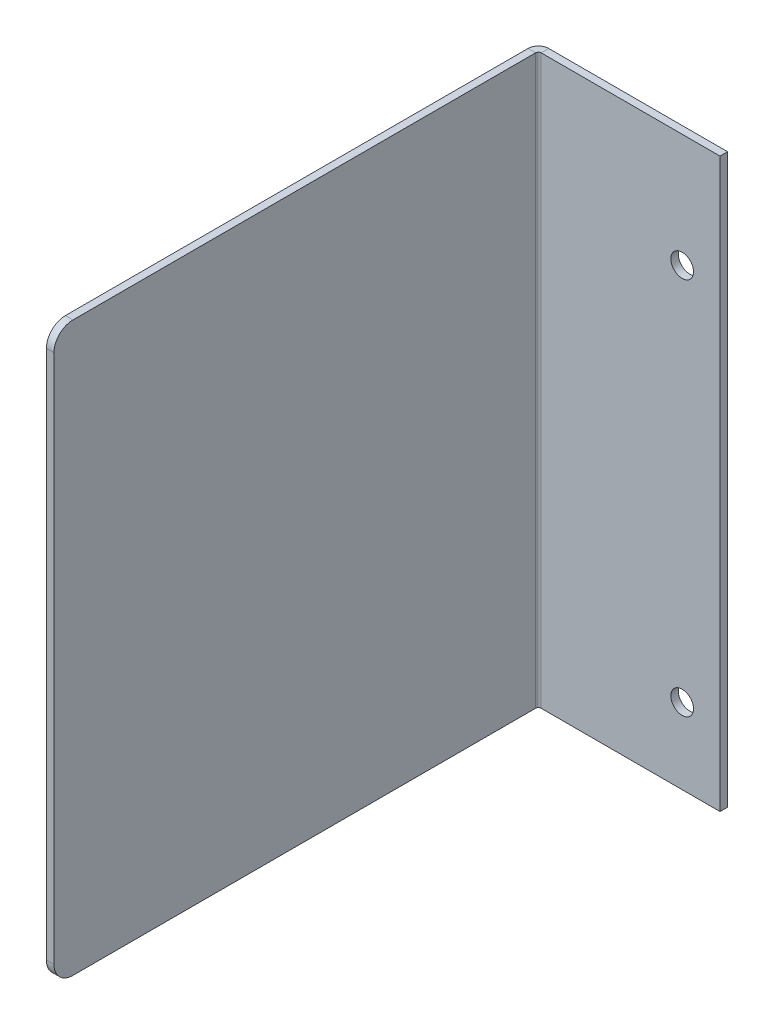
ISO-10303-21;
HEADER;
FILE_DESCRIPTION(('STEP AP214'),'2;1');
FILE_NAME('part.step','',(''),(''),'','','');
FILE_SCHEMA(('AUTOMOTIVE_DESIGN { 1 0 10303 214 1 1 1 1 }'));
ENDSEC;
DATA;
#1=APPLICATION_CONTEXT('core data for automotive mechanical design processes');
#2=APPLICATION_PROTOCOL_DEFINITION('international standard','automotive_design',2000,#1);
#3=PRODUCT_CONTEXT('',#1,'mechanical');
#4=PRODUCT('Part','Part','',(#3));
#5=PRODUCT_RELATED_PRODUCT_CATEGORY('part','',(#4));
#6=PRODUCT_DEFINITION_FORMATION('','',#4);
#7=PRODUCT_DEFINITION_CONTEXT('part definition',#1,'design');
#8=PRODUCT_DEFINITION('design','',#6,#7);
#9=PRODUCT_DEFINITION_SHAPE('','',#8);
#10=(LENGTH_UNIT() NAMED_UNIT(*) SI_UNIT(.MILLI.,.METRE.));
#11=(NAMED_UNIT(*) PLANE_ANGLE_UNIT() SI_UNIT($,.RADIAN.));
#12=(NAMED_UNIT(*) SI_UNIT($,.STERADIAN.) SOLID_ANGLE_UNIT());
#13=UNCERTAINTY_MEASURE_WITH_UNIT(LENGTH_MEASURE(1.E-05),#10,'distance_accuracy_value','');
#14=(GEOMETRIC_REPRESENTATION_CONTEXT(3) GLOBAL_UNCERTAINTY_ASSIGNED_CONTEXT((#13)) GLOBAL_UNIT_ASSIGNED_CONTEXT((#10,
#11,#12)) REPRESENTATION_CONTEXT('',''));
#15=CARTESIAN_POINT('',(0.,0.,0.));
#16=DIRECTION('',(0.,0.,1.));
#17=DIRECTION('',(1.,0.,0.));
#18=AXIS2_PLACEMENT_3D('',#15,#16,#17);
#19=CARTESIAN_POINT('',(-8.33759590792837,-142.250639386189,-2.));
#20=DIRECTION('',(0.,-1.,0.));
#21=DIRECTION('',(0.,0.,-1.));
#22=AXIS2_PLACEMENT_3D('',#19,#20,#21);
#23=PLANE('',#22);
#24=DIRECTION('',(1.,0.,0.));
#25=VECTOR('',#24,1.);
#26=CARTESIAN_POINT('',(-8.33759590792837,-142.250639386189,0.));
#27=LINE('',#26,#25);
#28=CARTESIAN_POINT('',(-5.60099590792838,-142.250639386189,0.));
#29=VERTEX_POINT('',#28);
#30=CARTESIAN_POINT('',(41.6624040920716,-142.250639386189,0.));
#31=VERTEX_POINT('',#30);
#32=EDGE_CURVE('E194',#29,#31,#27,.T.);
#33=ORIENTED_EDGE('',*,*,#32,.F.);
#34=DIRECTION('',(0.,0.,-1.));
#35=VECTOR('',#34,1.);
#36=CARTESIAN_POINT('',(-5.60099590792838,-142.250639386189,0.));
#37=LINE('',#36,#35);
#38=CARTESIAN_POINT('',(-5.60099590792835,-142.250639386189,-2.));
#39=VERTEX_POINT('',#38);
#40=EDGE_CURVE('E183',#29,#39,#37,.T.);
#41=ORIENTED_EDGE('',*,*,#40,.T.);
#42=DIRECTION('',(1.,0.,0.));
#43=VECTOR('',#42,1.);
#44=CARTESIAN_POINT('',(-8.33759590792837,-142.250639386189,-2.));
#45=LINE('',#44,#43);
#46=CARTESIAN_POINT('',(41.6624040920716,-142.250639386189,-2.));
#47=VERTEX_POINT('',#46);
#48=EDGE_CURVE('E197',#39,#47,#45,.T.);
#49=ORIENTED_EDGE('',*,*,#48,.T.);
#50=DIRECTION('',(0.,0.,1.));
#51=VECTOR('',#50,1.);
#52=CARTESIAN_POINT('',(41.6624040920716,-142.250639386189,-2.));
#53=LINE('',#52,#51);
#54=EDGE_CURVE('E206',#47,#31,#53,.T.);
#55=ORIENTED_EDGE('',*,*,#54,.T.);
#56=EDGE_LOOP('',(#33,#41,#49,#55));
#57=FACE_BOUND('',#56,.T.);
#58=ADVANCED_FACE('F59',(#57),#23,.T.);
#59=CARTESIAN_POINT('',(0.,0.,-2.));
#60=DIRECTION('',(0.,0.,1.));
#61=DIRECTION('',(1.,0.,0.));
#62=AXIS2_PLACEMENT_3D('',#59,#60,#61);
#63=PLANE('',#62);
#64=CARTESIAN_POINT('',(31.6624040920716,-122.250639386189,-2.));
#65=DIRECTION('',(0.,0.,1.));
#66=DIRECTION('',(1.,0.,0.));
#67=AXIS2_PLACEMENT_3D('',#64,#65,#66);
#68=CIRCLE('',#67,3.);
#69=CARTESIAN_POINT('',(34.6624040920716,-122.250639386189,-2.));
#70=VERTEX_POINT('',#69);
#71=EDGE_CURVE('E253',#70,#70,#68,.T.);
#72=ORIENTED_EDGE('',*,*,#71,.T.);
#73=EDGE_LOOP('',(#72));
#74=FACE_BOUND('',#73,.T.);
#75=CARTESIAN_POINT('',(31.6624040920716,-22.2506393861893,-2.));
#76=DIRECTION('',(0.,0.,1.));
#77=DIRECTION('',(1.,0.,0.));
#78=AXIS2_PLACEMENT_3D('',#75,#76,#77);
#79=CIRCLE('',#78,3.);
#80=CARTESIAN_POINT('',(34.6624040920716,-22.2506393861893,-2.));
#81=VERTEX_POINT('',#80);
#82=EDGE_CURVE('E180',#81,#81,#79,.T.);
#83=ORIENTED_EDGE('',*,*,#82,.T.);
#84=EDGE_LOOP('',(#83));
#85=FACE_BOUND('',#84,.T.);
#86=DIRECTION('',(0.,-1.,0.));
#87=VECTOR('',#86,1.);
#88=CARTESIAN_POINT('',(-5.60099590792835,-142.250639386189,-2.));
#89=LINE('',#88,#87);
#90=CARTESIAN_POINT('',(-5.60099590792838,7.74936061381078,-2.));
#91=VERTEX_POINT('',#90);
#92=EDGE_CURVE('E144',#39,#91,#89,.F.);
#93=ORIENTED_EDGE('',*,*,#92,.T.);
#94=DIRECTION('',(-1.,0.,0.));
#95=VECTOR('',#94,1.);
#96=CARTESIAN_POINT('',(-8.33759590792839,7.74936061381074,-2.));
#97=LINE('',#96,#95);
#98=CARTESIAN_POINT('',(41.6624040920716,7.74936061381074,-2.));
#99=VERTEX_POINT('',#98);
#100=EDGE_CURVE('E203',#99,#91,#97,.T.);
#101=ORIENTED_EDGE('',*,*,#100,.F.);
#102=DIRECTION('',(0.,1.,0.));
#103=VECTOR('',#102,1.);
#104=CARTESIAN_POINT('',(41.6624040920716,7.74936061381074,-2.));
#105=LINE('',#104,#103);
#106=EDGE_CURVE('E199',#47,#99,#105,.T.);
#107=ORIENTED_EDGE('',*,*,#106,.F.);
#108=ORIENTED_EDGE('',*,*,#48,.F.);
#109=EDGE_LOOP('',(#93,#101,#107,#108));
#110=FACE_BOUND('',#109,.T.);
#111=ADVANCED_FACE('F267',(#74,#85,#110),#63,.F.);
#112=CARTESIAN_POINT('',(0.,0.,0.));
#113=DIRECTION('',(0.,0.,1.));
#114=DIRECTION('',(1.,0.,0.));
#115=AXIS2_PLACEMENT_3D('',#112,#113,#114);
#116=PLANE('',#115);
#117=CARTESIAN_POINT('',(31.6624040920716,-122.250639386189,0.));
#118=DIRECTION('',(0.,0.,1.));
#119=DIRECTION('',(1.,0.,0.));
#120=AXIS2_PLACEMENT_3D('',#117,#118,#119);
#121=CIRCLE('',#120,3.);
#122=CARTESIAN_POINT('',(34.6624040920716,-122.250639386189,0.));
#123=VERTEX_POINT('',#122);
#124=EDGE_CURVE('E256',#123,#123,#121,.T.);
#125=ORIENTED_EDGE('',*,*,#124,.F.);
#126=EDGE_LOOP('',(#125));
#127=FACE_BOUND('',#126,.T.);
#128=CARTESIAN_POINT('',(31.6624040920716,-22.2506393861893,0.));
#129=DIRECTION('',(0.,0.,1.));
#130=DIRECTION('',(1.,0.,0.));
#131=AXIS2_PLACEMENT_3D('',#128,#129,#130);
#132=CIRCLE('',#131,3.);
#133=CARTESIAN_POINT('',(34.6624040920716,-22.2506393861893,0.));
#134=VERTEX_POINT('',#133);
#135=EDGE_CURVE('E250',#134,#134,#132,.T.);
#136=ORIENTED_EDGE('',*,*,#135,.F.);
#137=EDGE_LOOP('',(#136));
#138=FACE_BOUND('',#137,.T.);
#139=DIRECTION('',(-1.,0.,0.));
#140=VECTOR('',#139,1.);
#141=CARTESIAN_POINT('',(-8.33759590792839,7.74936061381074,0.));
#142=LINE('',#141,#140);
#143=CARTESIAN_POINT('',(41.6624040920716,7.74936061381074,0.));
#144=VERTEX_POINT('',#143);
#145=CARTESIAN_POINT('',(-5.60099590792838,7.74936061381076,0.));
#146=VERTEX_POINT('',#145);
#147=EDGE_CURVE('E200',#144,#146,#142,.T.);
#148=ORIENTED_EDGE('',*,*,#147,.T.);
#149=DIRECTION('',(0.,-1.,0.));
#150=VECTOR('',#149,1.);
#151=CARTESIAN_POINT('',(-5.60099590792838,-142.250639386189,0.));
#152=LINE('',#151,#150);
#153=EDGE_CURVE('E187',#29,#146,#152,.F.);
#154=ORIENTED_EDGE('',*,*,#153,.F.);
#155=ORIENTED_EDGE('',*,*,#32,.T.);
#156=DIRECTION('',(0.,1.,0.));
#157=VECTOR('',#156,1.);
#158=CARTESIAN_POINT('',(41.6624040920716,7.74936061381074,0.));
#159=LINE('',#158,#157);
#160=EDGE_CURVE('E208',#31,#144,#159,.T.);
#161=ORIENTED_EDGE('',*,*,#160,.T.);
#162=EDGE_LOOP('',(#148,#154,#155,#161));
#163=FACE_BOUND('',#162,.T.);
#164=ADVANCED_FACE('F263',(#127,#138,#163),#116,.T.);
#165=CARTESIAN_POINT('',(-8.33759590792839,7.74936061381074,-2.));
#166=DIRECTION('',(0.,1.,0.));
#167=DIRECTION('',(0.,0.,1.));
#168=AXIS2_PLACEMENT_3D('',#165,#166,#167);
#169=PLANE('',#168);
#170=DIRECTION('',(0.,0.,-1.));
#171=VECTOR('',#170,1.);
#172=CARTESIAN_POINT('',(-5.60099590792838,7.74936061381076,0.));
#173=LINE('',#172,#171);
#174=EDGE_CURVE('E191',#146,#91,#173,.T.);
#175=ORIENTED_EDGE('',*,*,#174,.F.);
#176=ORIENTED_EDGE('',*,*,#147,.F.);
#177=DIRECTION('',(0.,0.,1.));
#178=VECTOR('',#177,1.);
#179=CARTESIAN_POINT('',(41.6624040920716,7.74936061381074,-2.));
#180=LINE('',#179,#178);
#181=EDGE_CURVE('E213',#99,#144,#180,.T.);
#182=ORIENTED_EDGE('',*,*,#181,.F.);
#183=ORIENTED_EDGE('',*,*,#100,.T.);
#184=EDGE_LOOP('',(#175,#176,#182,#183));
#185=FACE_BOUND('',#184,.T.);
#186=ADVANCED_FACE('F266',(#185),#169,.T.);
#187=CARTESIAN_POINT('',(41.6624040920716,7.74936061381074,-2.));
#188=DIRECTION('',(1.,0.,0.));
#189=DIRECTION('',(0.,1.,0.));
#190=AXIS2_PLACEMENT_3D('',#187,#188,#189);
#191=PLANE('',#190);
#192=ORIENTED_EDGE('',*,*,#160,.F.);
#193=ORIENTED_EDGE('',*,*,#54,.F.);
#194=ORIENTED_EDGE('',*,*,#106,.T.);
#195=ORIENTED_EDGE('',*,*,#181,.T.);
#196=EDGE_LOOP('',(#192,#193,#194,#195));
#197=FACE_BOUND('',#196,.T.);
#198=ADVANCED_FACE('F286',(#197),#191,.T.);
#199=CARTESIAN_POINT('',(-5.60099590792838,7.74936061381076,0.736599999999996));
#200=DIRECTION('',(0.,1.,0.));
#201=DIRECTION('',(0.,0.,1.));
#202=AXIS2_PLACEMENT_3D('',#199,#200,#201);
#203=PLANE('',#202);
#204=DIRECTION('',(1.,0.,0.));
#205=VECTOR('',#204,1.);
#206=CARTESIAN_POINT('',(-8.33759590792839,7.74936061381074,0.736599999999989));
#207=LINE('',#206,#205);
#208=CARTESIAN_POINT('',(-6.33759590792839,7.74936061381076,0.736599999999993));
#209=VERTEX_POINT('',#208);
#210=CARTESIAN_POINT('',(-8.33759590792839,7.74936061381076,0.736599999999986));
#211=VERTEX_POINT('',#210);
#212=EDGE_CURVE('E177',#209,#211,#207,.F.);
#213=ORIENTED_EDGE('',*,*,#212,.F.);
#214=CARTESIAN_POINT('',(-5.60099590792838,7.74936061381076,0.736599999999996));
#215=DIRECTION('',(0.,-1.,0.));
#216=DIRECTION('',(0.,0.,-1.));
#217=AXIS2_PLACEMENT_3D('',#214,#215,#216);
#218=CIRCLE('',#217,0.736600000000009);
#219=EDGE_CURVE('E147',#146,#209,#218,.F.);
#220=ORIENTED_EDGE('',*,*,#219,.F.);
#221=ORIENTED_EDGE('',*,*,#174,.T.);
#222=CARTESIAN_POINT('',(-5.60099590792838,7.74936061381076,0.736599999999996));
#223=DIRECTION('',(0.,-1.,0.));
#224=DIRECTION('',(0.,0.,-1.));
#225=AXIS2_PLACEMENT_3D('',#222,#223,#224);
#226=CIRCLE('',#225,2.73660000000001);
#227=EDGE_CURVE('E182',#91,#211,#226,.F.);
#228=ORIENTED_EDGE('',*,*,#227,.T.);
#229=EDGE_LOOP('',(#213,#220,#221,#228));
#230=FACE_BOUND('',#229,.T.);
#231=ADVANCED_FACE('F279',(#230),#203,.T.);
#232=CARTESIAN_POINT('',(-5.60099590792838,-142.250639386189,0.736600000000007));
#233=DIRECTION('',(0.,1.,0.));
#234=DIRECTION('',(0.,0.,1.));
#235=AXIS2_PLACEMENT_3D('',#232,#233,#234);
#236=PLANE('',#235);
#237=CARTESIAN_POINT('',(-5.60099590792838,-142.250639386189,0.736600000000007));
#238=DIRECTION('',(0.,-1.,0.));
#239=DIRECTION('',(0.,0.,-1.));
#240=AXIS2_PLACEMENT_3D('',#237,#238,#239);
#241=CIRCLE('',#240,0.736600000000009);
#242=CARTESIAN_POINT('',(-6.33759590792839,-142.250639386189,0.736600000000004));
#243=VERTEX_POINT('',#242);
#244=EDGE_CURVE('E154',#243,#29,#241,.T.);
#245=ORIENTED_EDGE('',*,*,#244,.F.);
#246=DIRECTION('',(1.,0.,0.));
#247=VECTOR('',#246,1.);
#248=CARTESIAN_POINT('',(-6.33759590792838,-142.250639386189,0.736600000000001));
#249=LINE('',#248,#247);
#250=CARTESIAN_POINT('',(-8.33759590792838,-142.250639386189,0.736599999999994));
#251=VERTEX_POINT('',#250);
#252=EDGE_CURVE('E151',#243,#251,#249,.F.);
#253=ORIENTED_EDGE('',*,*,#252,.T.);
#254=CARTESIAN_POINT('',(-5.60099590792838,-142.250639386189,0.736600000000007));
#255=DIRECTION('',(0.,-1.,0.));
#256=DIRECTION('',(0.,0.,-1.));
#257=AXIS2_PLACEMENT_3D('',#254,#255,#256);
#258=CIRCLE('',#257,2.73660000000001);
#259=EDGE_CURVE('E137',#251,#39,#258,.T.);
#260=ORIENTED_EDGE('',*,*,#259,.T.);
#261=ORIENTED_EDGE('',*,*,#40,.F.);
#262=EDGE_LOOP('',(#245,#253,#260,#261));
#263=FACE_BOUND('',#262,.T.);
#264=ADVANCED_FACE('F152',(#263),#236,.F.);
#265=CARTESIAN_POINT('',(-5.60099590792838,-142.250639386189,0.736600000000007));
#266=DIRECTION('',(0.,-1.,0.));
#267=DIRECTION('',(-1.,0.,0.));
#268=AXIS2_PLACEMENT_3D('',#265,#266,#267);
#269=CYLINDRICAL_SURFACE('',#268,2.73660000000001);
#270=ORIENTED_EDGE('',*,*,#92,.F.);
#271=ORIENTED_EDGE('',*,*,#259,.F.);
#272=DIRECTION('',(0.,-1.,0.));
#273=VECTOR('',#272,1.);
#274=CARTESIAN_POINT('',(-8.33759590792839,7.74936061381074,0.736599999999989));
#275=LINE('',#274,#273);
#276=EDGE_CURVE('E142',#251,#211,#275,.F.);
#277=ORIENTED_EDGE('',*,*,#276,.T.);
#278=ORIENTED_EDGE('',*,*,#227,.F.);
#279=EDGE_LOOP('',(#270,#271,#277,#278));
#280=FACE_BOUND('',#279,.T.);
#281=ADVANCED_FACE('F139',(#280),#269,.T.);
#282=CARTESIAN_POINT('',(-5.60099590792838,-142.250639386189,0.736600000000007));
#283=DIRECTION('',(0.,-1.,0.));
#284=DIRECTION('',(-1.,0.,0.));
#285=AXIS2_PLACEMENT_3D('',#282,#283,#284);
#286=CYLINDRICAL_SURFACE('',#285,0.736600000000009);
#287=ORIENTED_EDGE('',*,*,#153,.T.);
#288=ORIENTED_EDGE('',*,*,#219,.T.);
#289=DIRECTION('',(0.,-1.,0.));
#290=VECTOR('',#289,1.);
#291=CARTESIAN_POINT('',(-6.33759590792839,7.74936061381074,0.736599999999996));
#292=LINE('',#291,#290);
#293=EDGE_CURVE('E155',#209,#243,#292,.T.);
#294=ORIENTED_EDGE('',*,*,#293,.T.);
#295=ORIENTED_EDGE('',*,*,#244,.T.);
#296=EDGE_LOOP('',(#287,#288,#294,#295));
#297=FACE_BOUND('',#296,.T.);
#298=ADVANCED_FACE('F277',(#297),#286,.F.);
#299=CARTESIAN_POINT('',(-8.33759590792882,-142.250639386189,128.));
#300=DIRECTION('',(0.,1.,0.));
#301=DIRECTION('',(-1.,0.,0.));
#302=AXIS2_PLACEMENT_3D('',#299,#300,#301);
#303=PLANE('',#302);
#304=DIRECTION('',(0.,0.,-1.));
#305=VECTOR('',#304,1.);
#306=CARTESIAN_POINT('',(-6.33759590792882,-142.250639386189,128.));
#307=LINE('',#306,#305);
#308=CARTESIAN_POINT('',(-6.3375959079288,-142.250639386189,123.));
#309=VERTEX_POINT('',#308);
#310=EDGE_CURVE('E163',#243,#309,#307,.F.);
#311=ORIENTED_EDGE('',*,*,#310,.T.);
#312=DIRECTION('',(1.,0.,0.));
#313=VECTOR('',#312,1.);
#314=CARTESIAN_POINT('',(-8.3375959079288,-142.250639386189,123.));
#315=LINE('',#314,#313);
#316=CARTESIAN_POINT('',(-8.3375959079288,-142.250639386189,123.));
#317=VERTEX_POINT('',#316);
#318=EDGE_CURVE('E67',#309,#317,#315,.F.);
#319=ORIENTED_EDGE('',*,*,#318,.T.);
#320=DIRECTION('',(0.,0.,1.));
#321=VECTOR('',#320,1.);
#322=CARTESIAN_POINT('',(-8.33759590792837,-142.250639386189,0.));
#323=LINE('',#322,#321);
#324=EDGE_CURVE('E159',#251,#317,#323,.T.);
#325=ORIENTED_EDGE('',*,*,#324,.F.);
#326=ORIENTED_EDGE('',*,*,#252,.F.);
#327=EDGE_LOOP('',(#311,#319,#325,#326));
#328=FACE_BOUND('',#327,.T.);
#329=ADVANCED_FACE('F165',(#328),#303,.F.);
#330=CARTESIAN_POINT('',(-8.33759590792839,7.74936061381074,0.));
#331=DIRECTION('',(0.,-1.,0.));
#332=DIRECTION('',(1.,0.,0.));
#333=AXIS2_PLACEMENT_3D('',#330,#331,#332);
#334=PLANE('',#333);
#335=DIRECTION('',(0.,0.,-1.));
#336=VECTOR('',#335,1.);
#337=CARTESIAN_POINT('',(-8.33759590792839,7.74936061381074,0.));
#338=LINE('',#337,#336);
#339=CARTESIAN_POINT('',(-8.33759590792882,7.74936061381074,123.));
#340=VERTEX_POINT('',#339);
#341=EDGE_CURVE('E162',#340,#211,#338,.T.);
#342=ORIENTED_EDGE('',*,*,#341,.F.);
#343=DIRECTION('',(1.,0.,0.));
#344=VECTOR('',#343,1.);
#345=CARTESIAN_POINT('',(-8.33759590792882,7.74936061381074,123.));
#346=LINE('',#345,#344);
#347=CARTESIAN_POINT('',(-6.33759590792882,7.74936061381074,123.));
#348=VERTEX_POINT('',#347);
#349=EDGE_CURVE('E215',#340,#348,#346,.T.);
#350=ORIENTED_EDGE('',*,*,#349,.T.);
#351=DIRECTION('',(0.,0.,1.));
#352=VECTOR('',#351,1.);
#353=CARTESIAN_POINT('',(-6.33759590792839,7.74936061381074,0.));
#354=LINE('',#353,#352);
#355=EDGE_CURVE('E167',#348,#209,#354,.F.);
#356=ORIENTED_EDGE('',*,*,#355,.T.);
#357=ORIENTED_EDGE('',*,*,#212,.T.);
#358=EDGE_LOOP('',(#342,#350,#356,#357));
#359=FACE_BOUND('',#358,.T.);
#360=ADVANCED_FACE('F245',(#359),#334,.F.);
#361=CARTESIAN_POINT('',(-8.33759590792839,0.,0.));
#362=DIRECTION('',(1.,0.,0.));
#363=DIRECTION('',(0.,0.,-1.));
#364=AXIS2_PLACEMENT_3D('',#361,#362,#363);
#365=PLANE('',#364);
#366=ORIENTED_EDGE('',*,*,#324,.T.);
#367=CARTESIAN_POINT('',(-8.3375959079288,-137.250639386189,123.));
#368=DIRECTION('',(1.,0.,0.));
#369=DIRECTION('',(0.,0.,-1.));
#370=AXIS2_PLACEMENT_3D('',#367,#368,#369);
#371=CIRCLE('',#370,5.);
#372=CARTESIAN_POINT('',(-8.33759590792882,-137.250639386189,128.));
#373=VERTEX_POINT('',#372);
#374=EDGE_CURVE('E13',#317,#373,#371,.F.);
#375=ORIENTED_EDGE('',*,*,#374,.T.);
#376=DIRECTION('',(0.,1.,0.));
#377=VECTOR('',#376,1.);
#378=CARTESIAN_POINT('',(-8.33759590792884,0.,128.));
#379=LINE('',#378,#377);
#380=CARTESIAN_POINT('',(-8.33759590792884,2.74936061381074,128.));
#381=VERTEX_POINT('',#380);
#382=EDGE_CURVE('E166',#373,#381,#379,.T.);
#383=ORIENTED_EDGE('',*,*,#382,.T.);
#384=CARTESIAN_POINT('',(-8.33759590792882,2.74936061381074,123.));
#385=DIRECTION('',(1.,0.,0.));
#386=DIRECTION('',(0.,0.,-1.));
#387=AXIS2_PLACEMENT_3D('',#384,#385,#386);
#388=CIRCLE('',#387,5.);
#389=EDGE_CURVE('E226',#381,#340,#388,.F.);
#390=ORIENTED_EDGE('',*,*,#389,.T.);
#391=ORIENTED_EDGE('',*,*,#341,.T.);
#392=ORIENTED_EDGE('',*,*,#276,.F.);
#393=EDGE_LOOP('',(#366,#375,#383,#390,#391,#392));
#394=FACE_BOUND('',#393,.T.);
#395=ADVANCED_FACE('F158',(#394),#365,.F.);
#396=CARTESIAN_POINT('',(-6.33759590792839,0.,0.));
#397=DIRECTION('',(1.,0.,0.));
#398=DIRECTION('',(0.,0.,-1.));
#399=AXIS2_PLACEMENT_3D('',#396,#397,#398);
#400=PLANE('',#399);
#401=DIRECTION('',(0.,-1.,0.));
#402=VECTOR('',#401,1.);
#403=CARTESIAN_POINT('',(-6.33759590792884,7.74936061381074,128.));
#404=LINE('',#403,#402);
#405=CARTESIAN_POINT('',(-6.33759590792882,-137.250639386189,128.));
#406=VERTEX_POINT('',#405);
#407=CARTESIAN_POINT('',(-6.33759590792884,2.74936061381074,128.));
#408=VERTEX_POINT('',#407);
#409=EDGE_CURVE('E170',#406,#408,#404,.F.);
#410=ORIENTED_EDGE('',*,*,#409,.F.);
#411=CARTESIAN_POINT('',(-6.3375959079288,-137.250639386189,123.));
#412=DIRECTION('',(1.,0.,0.));
#413=DIRECTION('',(0.,0.,-1.));
#414=AXIS2_PLACEMENT_3D('',#411,#412,#413);
#415=CIRCLE('',#414,5.);
#416=EDGE_CURVE('E81',#406,#309,#415,.T.);
#417=ORIENTED_EDGE('',*,*,#416,.T.);
#418=ORIENTED_EDGE('',*,*,#310,.F.);
#419=ORIENTED_EDGE('',*,*,#293,.F.);
#420=ORIENTED_EDGE('',*,*,#355,.F.);
#421=CARTESIAN_POINT('',(-6.33759590792882,2.74936061381074,123.));
#422=DIRECTION('',(1.,0.,0.));
#423=DIRECTION('',(0.,0.,-1.));
#424=AXIS2_PLACEMENT_3D('',#421,#422,#423);
#425=CIRCLE('',#424,5.);
#426=EDGE_CURVE('E220',#348,#408,#425,.T.);
#427=ORIENTED_EDGE('',*,*,#426,.T.);
#428=EDGE_LOOP('',(#410,#417,#418,#419,#420,#427));
#429=FACE_BOUND('',#428,.T.);
#430=ADVANCED_FACE('F236',(#429),#400,.T.);
#431=CARTESIAN_POINT('',(-8.33759590792884,7.74936061381074,128.));
#432=DIRECTION('',(0.,0.,-1.));
#433=DIRECTION('',(-1.,0.,0.));
#434=AXIS2_PLACEMENT_3D('',#431,#432,#433);
#435=PLANE('',#434);
#436=ORIENTED_EDGE('',*,*,#382,.F.);
#437=DIRECTION('',(1.,0.,0.));
#438=VECTOR('',#437,1.);
#439=CARTESIAN_POINT('',(-8.33759590792882,-137.250639386189,128.));
#440=LINE('',#439,#438);
#441=EDGE_CURVE('E228',#373,#406,#440,.T.);
#442=ORIENTED_EDGE('',*,*,#441,.T.);
#443=ORIENTED_EDGE('',*,*,#409,.T.);
#444=DIRECTION('',(1.,0.,0.));
#445=VECTOR('',#444,1.);
#446=CARTESIAN_POINT('',(-8.33759590792884,2.74936061381074,128.));
#447=LINE('',#446,#445);
#448=EDGE_CURVE('E223',#408,#381,#447,.F.);
#449=ORIENTED_EDGE('',*,*,#448,.T.);
#450=EDGE_LOOP('',(#436,#442,#443,#449));
#451=FACE_BOUND('',#450,.T.);
#452=ADVANCED_FACE('F234',(#451),#435,.F.);
#453=CARTESIAN_POINT('',(31.6624040920716,-22.2506393861893,-10.));
#454=DIRECTION('',(0.,0.,1.));
#455=DIRECTION('',(1.,0.,0.));
#456=AXIS2_PLACEMENT_3D('',#453,#454,#455);
#457=CYLINDRICAL_SURFACE('',#456,3.);
#458=ORIENTED_EDGE('',*,*,#135,.T.);
#459=EDGE_LOOP('',(#458));
#460=FACE_BOUND('',#459,.T.);
#461=ORIENTED_EDGE('',*,*,#82,.F.);
#462=EDGE_LOOP('',(#461));
#463=FACE_BOUND('',#462,.T.);
#464=ADVANCED_FACE('F307',(#460,#463),#457,.F.);
#465=CARTESIAN_POINT('',(31.6624040920716,-122.250639386189,-10.));
#466=DIRECTION('',(0.,0.,1.));
#467=DIRECTION('',(1.,0.,0.));
#468=AXIS2_PLACEMENT_3D('',#465,#466,#467);
#469=CYLINDRICAL_SURFACE('',#468,3.);
#470=ORIENTED_EDGE('',*,*,#124,.T.);
#471=EDGE_LOOP('',(#470));
#472=FACE_BOUND('',#471,.T.);
#473=ORIENTED_EDGE('',*,*,#71,.F.);
#474=EDGE_LOOP('',(#473));
#475=FACE_BOUND('',#474,.T.);
#476=ADVANCED_FACE('F260',(#472,#475),#469,.F.);
#477=CARTESIAN_POINT('',(-8.33759590792882,2.74936061381074,123.));
#478=DIRECTION('',(1.,0.,0.));
#479=DIRECTION('',(0.,0.,-1.));
#480=AXIS2_PLACEMENT_3D('',#477,#478,#479);
#481=CYLINDRICAL_SURFACE('',#480,5.);
#482=ORIENTED_EDGE('',*,*,#389,.F.);
#483=ORIENTED_EDGE('',*,*,#448,.F.);
#484=ORIENTED_EDGE('',*,*,#426,.F.);
#485=ORIENTED_EDGE('',*,*,#349,.F.);
#486=EDGE_LOOP('',(#482,#483,#484,#485));
#487=FACE_BOUND('',#486,.T.);
#488=ADVANCED_FACE('F243',(#487),#481,.T.);
#489=CARTESIAN_POINT('',(-8.3375959079288,-137.250639386189,123.));
#490=DIRECTION('',(1.,0.,0.));
#491=DIRECTION('',(0.,0.,-1.));
#492=AXIS2_PLACEMENT_3D('',#489,#490,#491);
#493=CYLINDRICAL_SURFACE('',#492,5.);
#494=ORIENTED_EDGE('',*,*,#374,.F.);
#495=ORIENTED_EDGE('',*,*,#318,.F.);
#496=ORIENTED_EDGE('',*,*,#416,.F.);
#497=ORIENTED_EDGE('',*,*,#441,.F.);
#498=EDGE_LOOP('',(#494,#495,#496,#497));
#499=FACE_BOUND('',#498,.T.);
#500=ADVANCED_FACE('F61',(#499),#493,.T.);
#501=CLOSED_SHELL('',(#58,#111,#164,#186,#198,#231,#264,#281,#298,#329,#360,#395,#430,#452,#464,
#476,#488,#500));
#502=MANIFOLD_SOLID_BREP('B2',#501);
#503=ADVANCED_BREP_SHAPE_REPRESENTATION('',(#18,#502),#14);
#504=SHAPE_DEFINITION_REPRESENTATION(#9,#503);
ENDSEC;
END-ISO-10303-21;
